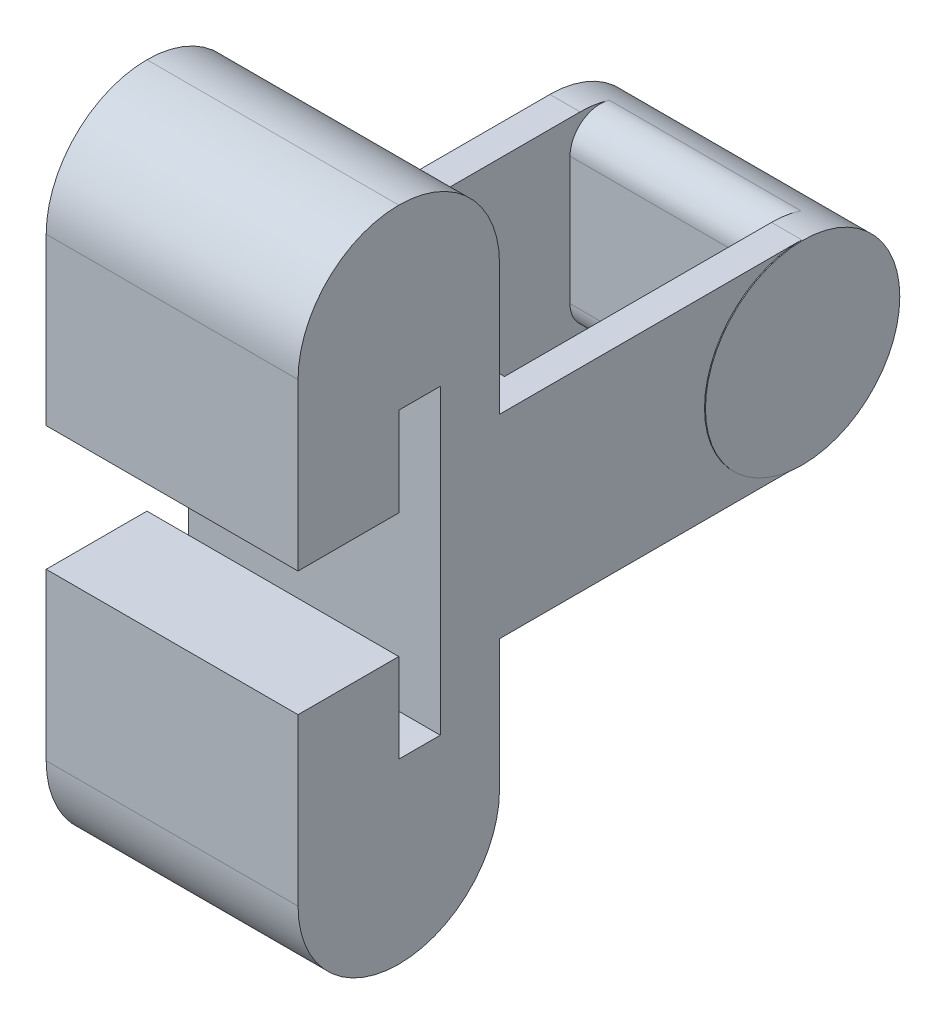
ISO-10303-21;
HEADER;
FILE_DESCRIPTION(('STEP AP214'),'2;1');
FILE_NAME('part.step','',(''),(''),'','','');
FILE_SCHEMA(('AUTOMOTIVE_DESIGN { 1 0 10303 214 1 1 1 1 }'));
ENDSEC;
DATA;
#1=APPLICATION_CONTEXT('core data for automotive mechanical design processes');
#2=APPLICATION_PROTOCOL_DEFINITION('international standard','automotive_design',2000,#1);
#3=PRODUCT_CONTEXT('',#1,'mechanical');
#4=PRODUCT('Part','Part','',(#3));
#5=PRODUCT_RELATED_PRODUCT_CATEGORY('part','',(#4));
#6=PRODUCT_DEFINITION_FORMATION('','',#4);
#7=PRODUCT_DEFINITION_CONTEXT('part definition',#1,'design');
#8=PRODUCT_DEFINITION('design','',#6,#7);
#9=PRODUCT_DEFINITION_SHAPE('','',#8);
#10=(LENGTH_UNIT() NAMED_UNIT(*) SI_UNIT(.MILLI.,.METRE.));
#11=(NAMED_UNIT(*) PLANE_ANGLE_UNIT() SI_UNIT($,.RADIAN.));
#12=(NAMED_UNIT(*) SI_UNIT($,.STERADIAN.) SOLID_ANGLE_UNIT());
#13=UNCERTAINTY_MEASURE_WITH_UNIT(LENGTH_MEASURE(1.E-05),#10,'distance_accuracy_value','');
#14=(GEOMETRIC_REPRESENTATION_CONTEXT(3) GLOBAL_UNCERTAINTY_ASSIGNED_CONTEXT((#13)) GLOBAL_UNIT_ASSIGNED_CONTEXT((#10,
#11,#12)) REPRESENTATION_CONTEXT('',''));
#15=CARTESIAN_POINT('',(0.,0.,0.));
#16=DIRECTION('',(0.,0.,1.));
#17=DIRECTION('',(1.,0.,0.));
#18=AXIS2_PLACEMENT_3D('',#15,#16,#17);
#19=CARTESIAN_POINT('',(0.,38.1,0.));
#20=DIRECTION('',(0.,1.,0.));
#21=DIRECTION('',(-1.,0.,0.));
#22=AXIS2_PLACEMENT_3D('',#19,#20,#21);
#23=PLANE('',#22);
#24=DIRECTION('',(1.,0.,0.));
#25=VECTOR('',#24,1.);
#26=CARTESIAN_POINT('',(0.,38.1,101.6));
#27=LINE('',#26,#25);
#28=CARTESIAN_POINT('',(-63.5,38.1,101.6));
#29=VERTEX_POINT('',#28);
#30=CARTESIAN_POINT('',(0.,38.1,101.6));
#31=VERTEX_POINT('',#30);
#32=EDGE_CURVE('E282',#29,#31,#27,.T.);
#33=ORIENTED_EDGE('',*,*,#32,.F.);
#34=DIRECTION('',(0.,0.,1.));
#35=VECTOR('',#34,1.);
#36=CARTESIAN_POINT('',(-63.5,38.1,76.2));
#37=LINE('',#36,#35);
#38=CARTESIAN_POINT('',(-63.5,38.1,91.1297825490581));
#39=VERTEX_POINT('',#38);
#40=EDGE_CURVE('E303',#39,#29,#37,.T.);
#41=ORIENTED_EDGE('',*,*,#40,.F.);
#42=DIRECTION('',(-1.,0.,0.));
#43=VECTOR('',#42,1.);
#44=CARTESIAN_POINT('',(0.,38.1,91.1297825490581));
#45=LINE('',#44,#43);
#46=CARTESIAN_POINT('',(0.,38.1,91.1297825490581));
#47=VERTEX_POINT('',#46);
#48=EDGE_CURVE('E311',#47,#39,#45,.T.);
#49=ORIENTED_EDGE('',*,*,#48,.F.);
#50=DIRECTION('',(0.,0.,-1.));
#51=VECTOR('',#50,1.);
#52=CARTESIAN_POINT('',(0.,38.1,127.));
#53=LINE('',#52,#51);
#54=EDGE_CURVE('E301',#31,#47,#53,.T.);
#55=ORIENTED_EDGE('',*,*,#54,.F.);
#56=EDGE_LOOP('',(#33,#41,#49,#55));
#57=FACE_BOUND('',#56,.T.);
#58=ADVANCED_FACE('F47',(#57),#23,.F.);
#59=CARTESIAN_POINT('',(0.2286,0.,0.));
#60=DIRECTION('',(-1.,0.,0.));
#61=DIRECTION('',(0.,0.,1.));
#62=AXIS2_PLACEMENT_3D('',#59,#60,#61);
#63=CYLINDRICAL_SURFACE('',#62,24.5059058177304);
#64=CARTESIAN_POINT('',(0.2286,0.,0.));
#65=DIRECTION('',(1.,0.,0.));
#66=DIRECTION('',(0.,0.,-1.));
#67=AXIS2_PLACEMENT_3D('',#64,#65,#66);
#68=CIRCLE('',#67,24.5059058177304);
#69=CARTESIAN_POINT('',(0.2286,0.,-24.5059058177304));
#70=VERTEX_POINT('',#69);
#71=EDGE_CURVE('E354',#70,#70,#68,.T.);
#72=ORIENTED_EDGE('',*,*,#71,.F.);
#73=EDGE_LOOP('',(#72));
#74=FACE_BOUND('',#73,.T.);
#75=DIRECTION('',(-1.,0.,0.));
#76=VECTOR('',#75,1.);
#77=CARTESIAN_POINT('',(0.2286,-23.3706404062894,-7.37242069793817));
#78=LINE('',#77,#76);
#79=CARTESIAN_POINT('',(-7.62000000000001,-23.3706404062894,-7.37242069793817));
#80=VERTEX_POINT('',#79);
#81=CARTESIAN_POINT('',(-55.88,-23.3706404062894,-7.37242069793817));
#82=VERTEX_POINT('',#81);
#83=EDGE_CURVE('E399',#80,#82,#78,.T.);
#84=ORIENTED_EDGE('',*,*,#83,.T.);
#85=CARTESIAN_POINT('',(-55.88,0.,0.));
#86=DIRECTION('',(-1.,0.,0.));
#87=DIRECTION('',(0.,0.,1.));
#88=AXIS2_PLACEMENT_3D('',#85,#86,#87);
#89=CIRCLE('',#88,24.5059058177304);
#90=CARTESIAN_POINT('',(-55.88,-24.5059058177304,0.));
#91=VERTEX_POINT('',#90);
#92=EDGE_CURVE('E402',#82,#91,#89,.T.);
#93=ORIENTED_EDGE('',*,*,#92,.T.);
#94=DIRECTION('',(1.,0.,0.));
#95=VECTOR('',#94,1.);
#96=CARTESIAN_POINT('',(-63.5,-24.5059058177304,0.));
#97=LINE('',#96,#95);
#98=CARTESIAN_POINT('',(-63.5,-24.5059058177304,0.));
#99=VERTEX_POINT('',#98);
#100=EDGE_CURVE('E350',#99,#91,#97,.T.);
#101=ORIENTED_EDGE('',*,*,#100,.F.);
#102=CARTESIAN_POINT('',(-63.5,0.,0.));
#103=DIRECTION('',(-1.,0.,0.));
#104=DIRECTION('',(0.,0.,1.));
#105=AXIS2_PLACEMENT_3D('',#102,#103,#104);
#106=CIRCLE('',#105,24.5059058177304);
#107=CARTESIAN_POINT('',(-63.5,24.5059058177304,0.));
#108=VERTEX_POINT('',#107);
#109=EDGE_CURVE('E329',#108,#99,#106,.T.);
#110=ORIENTED_EDGE('',*,*,#109,.F.);
#111=DIRECTION('',(1.,0.,0.));
#112=VECTOR('',#111,1.);
#113=CARTESIAN_POINT('',(-63.5,24.5059058177304,0.));
#114=LINE('',#113,#112);
#115=CARTESIAN_POINT('',(-55.88,24.5059058177304,0.));
#116=VERTEX_POINT('',#115);
#117=EDGE_CURVE('E342',#108,#116,#114,.T.);
#118=ORIENTED_EDGE('',*,*,#117,.T.);
#119=CARTESIAN_POINT('',(-55.88,0.,0.));
#120=DIRECTION('',(-1.,0.,0.));
#121=DIRECTION('',(0.,0.,1.));
#122=AXIS2_PLACEMENT_3D('',#119,#120,#121);
#123=CIRCLE('',#122,24.5059058177304);
#124=CARTESIAN_POINT('',(-55.88,23.3706404062894,-7.37242069793818));
#125=VERTEX_POINT('',#124);
#126=EDGE_CURVE('E234',#116,#125,#123,.T.);
#127=ORIENTED_EDGE('',*,*,#126,.T.);
#128=DIRECTION('',(-1.,0.,0.));
#129=VECTOR('',#128,1.);
#130=CARTESIAN_POINT('',(0.2286,23.3706404062894,-7.37242069793818));
#131=LINE('',#130,#129);
#132=CARTESIAN_POINT('',(-7.62000000000001,23.3706404062894,-7.37242069793818));
#133=VERTEX_POINT('',#132);
#134=EDGE_CURVE('E392',#125,#133,#131,.F.);
#135=ORIENTED_EDGE('',*,*,#134,.T.);
#136=CARTESIAN_POINT('',(-7.62000000000001,0.,0.));
#137=DIRECTION('',(1.,0.,0.));
#138=DIRECTION('',(0.,0.,-1.));
#139=AXIS2_PLACEMENT_3D('',#136,#137,#138);
#140=CIRCLE('',#139,24.5059058177304);
#141=CARTESIAN_POINT('',(-7.62000000000001,24.5059058177304,0.));
#142=VERTEX_POINT('',#141);
#143=EDGE_CURVE('E387',#133,#142,#140,.T.);
#144=ORIENTED_EDGE('',*,*,#143,.T.);
#145=CARTESIAN_POINT('',(0.,24.5059058177304,0.));
#146=VERTEX_POINT('',#145);
#147=EDGE_CURVE('E337',#142,#146,#114,.T.);
#148=ORIENTED_EDGE('',*,*,#147,.T.);
#149=CARTESIAN_POINT('',(0.,0.,0.));
#150=DIRECTION('',(1.,0.,0.));
#151=DIRECTION('',(0.,0.,-1.));
#152=AXIS2_PLACEMENT_3D('',#149,#150,#151);
#153=CIRCLE('',#152,24.5059058177304);
#154=CARTESIAN_POINT('',(0.,-24.5059058177304,0.));
#155=VERTEX_POINT('',#154);
#156=EDGE_CURVE('E353',#146,#155,#153,.T.);
#157=ORIENTED_EDGE('',*,*,#156,.T.);
#158=CARTESIAN_POINT('',(-7.62000000000001,-24.5059058177304,0.));
#159=VERTEX_POINT('',#158);
#160=EDGE_CURVE('E349',#159,#155,#97,.T.);
#161=ORIENTED_EDGE('',*,*,#160,.F.);
#162=CARTESIAN_POINT('',(-7.62000000000001,0.,0.));
#163=DIRECTION('',(1.,0.,0.));
#164=DIRECTION('',(0.,0.,-1.));
#165=AXIS2_PLACEMENT_3D('',#162,#163,#164);
#166=CIRCLE('',#165,24.5059058177304);
#167=EDGE_CURVE('E396',#159,#80,#166,.T.);
#168=ORIENTED_EDGE('',*,*,#167,.T.);
#169=EDGE_LOOP('',(#84,#93,#101,#110,#118,#127,#135,#144,#148,#157,#161,#168));
#170=FACE_BOUND('',#169,.T.);
#171=ADVANCED_FACE('F418',(#74,#170),#63,.T.);
#172=CARTESIAN_POINT('',(0.2286,0.,0.));
#173=DIRECTION('',(1.,0.,0.));
#174=DIRECTION('',(0.,0.,-1.));
#175=AXIS2_PLACEMENT_3D('',#172,#173,#174);
#176=PLANE('',#175);
#177=ORIENTED_EDGE('',*,*,#71,.T.);
#178=EDGE_LOOP('',(#177));
#179=FACE_BOUND('',#178,.T.);
#180=ADVANCED_FACE('F527',(#179),#176,.T.);
#181=CARTESIAN_POINT('',(-63.5,-24.5059058177305,76.2));
#182=DIRECTION('',(0.,1.,0.));
#183=DIRECTION('',(0.,0.,1.));
#184=AXIS2_PLACEMENT_3D('',#181,#182,#183);
#185=PLANE('',#184);
#186=ORIENTED_EDGE('',*,*,#100,.T.);
#187=DIRECTION('',(0.,0.,1.));
#188=VECTOR('',#187,1.);
#189=CARTESIAN_POINT('',(-55.88,-24.5059058177305,76.2));
#190=LINE('',#189,#188);
#191=CARTESIAN_POINT('',(-55.88,-24.5059058177305,67.31));
#192=VERTEX_POINT('',#191);
#193=EDGE_CURVE('E246',#91,#192,#190,.T.);
#194=ORIENTED_EDGE('',*,*,#193,.T.);
#195=DIRECTION('',(1.,0.,0.));
#196=VECTOR('',#195,1.);
#197=CARTESIAN_POINT('',(-63.5,-24.5059058177305,67.31));
#198=LINE('',#197,#196);
#199=CARTESIAN_POINT('',(-7.62,-24.5059058177305,67.31));
#200=VERTEX_POINT('',#199);
#201=EDGE_CURVE('E226',#192,#200,#198,.T.);
#202=ORIENTED_EDGE('',*,*,#201,.T.);
#203=DIRECTION('',(0.,0.,-1.));
#204=VECTOR('',#203,1.);
#205=CARTESIAN_POINT('',(-7.62,-24.5059058177305,76.2));
#206=LINE('',#205,#204);
#207=EDGE_CURVE('E70',#200,#159,#206,.T.);
#208=ORIENTED_EDGE('',*,*,#207,.T.);
#209=ORIENTED_EDGE('',*,*,#160,.T.);
#210=DIRECTION('',(0.,0.,1.));
#211=VECTOR('',#210,1.);
#212=CARTESIAN_POINT('',(0.,-24.5059058177305,76.2));
#213=LINE('',#212,#211);
#214=CARTESIAN_POINT('',(0.,-24.5059058177305,76.2));
#215=VERTEX_POINT('',#214);
#216=EDGE_CURVE('E324',#155,#215,#213,.T.);
#217=ORIENTED_EDGE('',*,*,#216,.T.);
#218=DIRECTION('',(1.,0.,0.));
#219=VECTOR('',#218,1.);
#220=CARTESIAN_POINT('',(-63.5,-24.5059058177305,76.2));
#221=LINE('',#220,#219);
#222=CARTESIAN_POINT('',(-63.5,-24.5059058177305,76.2));
#223=VERTEX_POINT('',#222);
#224=EDGE_CURVE('E346',#223,#215,#221,.T.);
#225=ORIENTED_EDGE('',*,*,#224,.F.);
#226=DIRECTION('',(0.,0.,1.));
#227=VECTOR('',#226,1.);
#228=CARTESIAN_POINT('',(-63.5,-24.5059058177305,76.2));
#229=LINE('',#228,#227);
#230=EDGE_CURVE('E332',#99,#223,#229,.T.);
#231=ORIENTED_EDGE('',*,*,#230,.F.);
#232=EDGE_LOOP('',(#186,#194,#202,#208,#209,#217,#225,#231));
#233=FACE_BOUND('',#232,.T.);
#234=ADVANCED_FACE('F435',(#233),#185,.F.);
#235=CARTESIAN_POINT('',(-63.5,24.5059058177304,0.));
#236=DIRECTION('',(0.,-1.,0.));
#237=DIRECTION('',(0.,0.,-1.));
#238=AXIS2_PLACEMENT_3D('',#235,#236,#237);
#239=PLANE('',#238);
#240=DIRECTION('',(0.,0.,1.));
#241=VECTOR('',#240,1.);
#242=CARTESIAN_POINT('',(-55.88,24.5059058177304,2.53999999999999));
#243=LINE('',#242,#241);
#244=CARTESIAN_POINT('',(-55.88,24.5059058177305,67.31));
#245=VERTEX_POINT('',#244);
#246=EDGE_CURVE('E62',#116,#245,#243,.T.);
#247=ORIENTED_EDGE('',*,*,#246,.F.);
#248=ORIENTED_EDGE('',*,*,#117,.F.);
#249=DIRECTION('',(0.,0.,-1.));
#250=VECTOR('',#249,1.);
#251=CARTESIAN_POINT('',(-63.5,24.5059058177304,0.));
#252=LINE('',#251,#250);
#253=CARTESIAN_POINT('',(-63.5,24.5059058177305,76.2));
#254=VERTEX_POINT('',#253);
#255=EDGE_CURVE('E335',#254,#108,#252,.T.);
#256=ORIENTED_EDGE('',*,*,#255,.F.);
#257=DIRECTION('',(1.,0.,0.));
#258=VECTOR('',#257,1.);
#259=CARTESIAN_POINT('',(-63.5,24.5059058177305,76.2));
#260=LINE('',#259,#258);
#261=CARTESIAN_POINT('',(0.,24.5059058177305,76.2));
#262=VERTEX_POINT('',#261);
#263=EDGE_CURVE('E344',#254,#262,#260,.T.);
#264=ORIENTED_EDGE('',*,*,#263,.T.);
#265=DIRECTION('',(0.,0.,-1.));
#266=VECTOR('',#265,1.);
#267=CARTESIAN_POINT('',(0.,24.5059058177304,0.));
#268=LINE('',#267,#266);
#269=EDGE_CURVE('E333',#262,#146,#268,.T.);
#270=ORIENTED_EDGE('',*,*,#269,.T.);
#271=ORIENTED_EDGE('',*,*,#147,.F.);
#272=DIRECTION('',(0.,0.,-1.));
#273=VECTOR('',#272,1.);
#274=CARTESIAN_POINT('',(-7.62,24.5059058177305,67.31));
#275=LINE('',#274,#273);
#276=CARTESIAN_POINT('',(-7.62,24.5059058177305,67.31));
#277=VERTEX_POINT('',#276);
#278=EDGE_CURVE('E236',#277,#142,#275,.T.);
#279=ORIENTED_EDGE('',*,*,#278,.F.);
#280=DIRECTION('',(1.,0.,0.));
#281=VECTOR('',#280,1.);
#282=CARTESIAN_POINT('',(-55.88,24.5059058177305,67.31));
#283=LINE('',#282,#281);
#284=EDGE_CURVE('E224',#245,#277,#283,.T.);
#285=ORIENTED_EDGE('',*,*,#284,.F.);
#286=EDGE_LOOP('',(#247,#248,#256,#264,#270,#271,#279,#285));
#287=FACE_BOUND('',#286,.T.);
#288=ADVANCED_FACE('F238',(#287),#239,.F.);
#289=CARTESIAN_POINT('',(-63.5,0.,0.));
#290=DIRECTION('',(-1.,0.,0.));
#291=DIRECTION('',(0.,0.,1.));
#292=AXIS2_PLACEMENT_3D('',#289,#290,#291);
#293=PLANE('',#292);
#294=DIRECTION('',(0.,-1.,0.));
#295=VECTOR('',#294,1.);
#296=CARTESIAN_POINT('',(-63.5,38.1,76.2));
#297=LINE('',#296,#295);
#298=CARTESIAN_POINT('',(-63.5,-57.4893476471741,76.2));
#299=VERTEX_POINT('',#298);
#300=EDGE_CURVE('E310',#223,#299,#297,.T.);
#301=ORIENTED_EDGE('',*,*,#300,.T.);
#302=CARTESIAN_POINT('',(-63.5,-57.4893476471742,101.6));
#303=DIRECTION('',(-1.,0.,0.));
#304=DIRECTION('',(0.,0.,1.));
#305=AXIS2_PLACEMENT_3D('',#302,#303,#304);
#306=CIRCLE('',#305,25.4);
#307=CARTESIAN_POINT('',(-63.5,-82.8893476471741,101.6));
#308=VERTEX_POINT('',#307);
#309=EDGE_CURVE('E379',#299,#308,#306,.T.);
#310=ORIENTED_EDGE('',*,*,#309,.T.);
#311=CARTESIAN_POINT('',(-63.5,-57.4893476471742,101.6));
#312=DIRECTION('',(-1.,0.,0.));
#313=DIRECTION('',(0.,0.,1.));
#314=AXIS2_PLACEMENT_3D('',#311,#312,#313);
#315=CIRCLE('',#314,25.4);
#316=CARTESIAN_POINT('',(-63.5,-57.4893476471742,127.));
#317=VERTEX_POINT('',#316);
#318=EDGE_CURVE('E377',#308,#317,#315,.T.);
#319=ORIENTED_EDGE('',*,*,#318,.T.);
#320=DIRECTION('',(0.,1.,0.));
#321=VECTOR('',#320,1.);
#322=CARTESIAN_POINT('',(-63.5,-82.8893476471741,127.));
#323=LINE('',#322,#321);
#324=CARTESIAN_POINT('',(-63.5,-15.68196,127.));
#325=VERTEX_POINT('',#324);
#326=EDGE_CURVE('E278',#317,#325,#323,.T.);
#327=ORIENTED_EDGE('',*,*,#326,.T.);
#328=DIRECTION('',(0.,0.,-1.));
#329=VECTOR('',#328,1.);
#330=CARTESIAN_POINT('',(-63.5,-15.68196,101.6));
#331=LINE('',#330,#329);
#332=CARTESIAN_POINT('',(-63.5,-15.68196,101.6));
#333=VERTEX_POINT('',#332);
#334=EDGE_CURVE('E254',#325,#333,#331,.T.);
#335=ORIENTED_EDGE('',*,*,#334,.T.);
#336=DIRECTION('',(0.,-1.,0.));
#337=VECTOR('',#336,1.);
#338=CARTESIAN_POINT('',(-63.5,-15.68196,101.6));
#339=LINE('',#338,#337);
#340=CARTESIAN_POINT('',(-63.5,-38.1,101.6));
#341=VERTEX_POINT('',#340);
#342=EDGE_CURVE('E266',#333,#341,#339,.T.);
#343=ORIENTED_EDGE('',*,*,#342,.T.);
#344=DIRECTION('',(0.,0.,1.));
#345=VECTOR('',#344,1.);
#346=CARTESIAN_POINT('',(-63.5,-38.1,76.2));
#347=LINE('',#346,#345);
#348=CARTESIAN_POINT('',(-63.5,-38.1,91.1297825490581));
#349=VERTEX_POINT('',#348);
#350=EDGE_CURVE('E275',#349,#341,#347,.T.);
#351=ORIENTED_EDGE('',*,*,#350,.F.);
#352=DIRECTION('',(0.,-1.,0.));
#353=VECTOR('',#352,1.);
#354=CARTESIAN_POINT('',(-63.5,38.1,91.1297825490581));
#355=LINE('',#354,#353);
#356=EDGE_CURVE('E314',#39,#349,#355,.T.);
#357=ORIENTED_EDGE('',*,*,#356,.F.);
#358=ORIENTED_EDGE('',*,*,#40,.T.);
#359=DIRECTION('',(0.,1.,0.));
#360=VECTOR('',#359,1.);
#361=CARTESIAN_POINT('',(-63.5,15.68196,101.6));
#362=LINE('',#361,#360);
#363=CARTESIAN_POINT('',(-63.5,15.68196,101.6));
#364=VERTEX_POINT('',#363);
#365=EDGE_CURVE('E298',#364,#29,#362,.T.);
#366=ORIENTED_EDGE('',*,*,#365,.F.);
#367=DIRECTION('',(0.,0.,-1.));
#368=VECTOR('',#367,1.);
#369=CARTESIAN_POINT('',(-63.5,15.68196,101.6));
#370=LINE('',#369,#368);
#371=CARTESIAN_POINT('',(-63.5,15.68196,127.));
#372=VERTEX_POINT('',#371);
#373=EDGE_CURVE('E283',#372,#364,#370,.T.);
#374=ORIENTED_EDGE('',*,*,#373,.F.);
#375=DIRECTION('',(0.,-1.,0.));
#376=VECTOR('',#375,1.);
#377=CARTESIAN_POINT('',(-63.5,82.8893476471741,127.));
#378=LINE('',#377,#376);
#379=CARTESIAN_POINT('',(-63.5,57.4893476471742,127.));
#380=VERTEX_POINT('',#379);
#381=EDGE_CURVE('E308',#380,#372,#378,.T.);
#382=ORIENTED_EDGE('',*,*,#381,.F.);
#383=CARTESIAN_POINT('',(-63.5,57.4893476471742,101.6));
#384=DIRECTION('',(-1.,0.,0.));
#385=DIRECTION('',(0.,0.,1.));
#386=AXIS2_PLACEMENT_3D('',#383,#384,#385);
#387=CIRCLE('',#386,25.4);
#388=CARTESIAN_POINT('',(-63.5,82.8893476471741,101.6));
#389=VERTEX_POINT('',#388);
#390=EDGE_CURVE('E357',#380,#389,#387,.T.);
#391=ORIENTED_EDGE('',*,*,#390,.T.);
#392=CARTESIAN_POINT('',(-63.5,57.4893476471742,101.6));
#393=DIRECTION('',(-1.,0.,0.));
#394=DIRECTION('',(0.,0.,1.));
#395=AXIS2_PLACEMENT_3D('',#392,#393,#394);
#396=CIRCLE('',#395,25.4);
#397=CARTESIAN_POINT('',(-63.5,57.4893476471742,76.2));
#398=VERTEX_POINT('',#397);
#399=EDGE_CURVE('E361',#389,#398,#396,.T.);
#400=ORIENTED_EDGE('',*,*,#399,.T.);
#401=EDGE_CURVE('E325',#398,#254,#297,.T.);
#402=ORIENTED_EDGE('',*,*,#401,.T.);
#403=ORIENTED_EDGE('',*,*,#255,.T.);
#404=ORIENTED_EDGE('',*,*,#109,.T.);
#405=ORIENTED_EDGE('',*,*,#230,.T.);
#406=EDGE_LOOP('',(#301,#310,#319,#327,#335,#343,#351,#357,#358,#366,#374,#382,#391,#400,#402,
#403,#404,#405));
#407=FACE_BOUND('',#406,.T.);
#408=ADVANCED_FACE('F452',(#407),#293,.T.);
#409=CARTESIAN_POINT('',(0.,0.,0.));
#410=DIRECTION('',(-1.,0.,0.));
#411=DIRECTION('',(0.,0.,1.));
#412=AXIS2_PLACEMENT_3D('',#409,#410,#411);
#413=PLANE('',#412);
#414=CARTESIAN_POINT('',(0.,-57.4893476471742,101.6));
#415=DIRECTION('',(-1.,0.,0.));
#416=DIRECTION('',(0.,0.,1.));
#417=AXIS2_PLACEMENT_3D('',#414,#415,#416);
#418=CIRCLE('',#417,25.4);
#419=CARTESIAN_POINT('',(0.,-57.4893476471742,127.));
#420=VERTEX_POINT('',#419);
#421=CARTESIAN_POINT('',(0.,-82.8893476471742,101.6));
#422=VERTEX_POINT('',#421);
#423=EDGE_CURVE('E381',#420,#422,#418,.F.);
#424=ORIENTED_EDGE('',*,*,#423,.T.);
#425=CARTESIAN_POINT('',(0.,-57.4893476471742,101.6));
#426=DIRECTION('',(-1.,0.,0.));
#427=DIRECTION('',(0.,0.,1.));
#428=AXIS2_PLACEMENT_3D('',#425,#426,#427);
#429=CIRCLE('',#428,25.4);
#430=CARTESIAN_POINT('',(0.,-57.4893476471742,76.2));
#431=VERTEX_POINT('',#430);
#432=EDGE_CURVE('E383',#422,#431,#429,.F.);
#433=ORIENTED_EDGE('',*,*,#432,.T.);
#434=DIRECTION('',(0.,1.,0.));
#435=VECTOR('',#434,1.);
#436=CARTESIAN_POINT('',(0.,-38.1,76.2));
#437=LINE('',#436,#435);
#438=EDGE_CURVE('E315',#431,#215,#437,.T.);
#439=ORIENTED_EDGE('',*,*,#438,.T.);
#440=ORIENTED_EDGE('',*,*,#216,.F.);
#441=ORIENTED_EDGE('',*,*,#156,.F.);
#442=ORIENTED_EDGE('',*,*,#269,.F.);
#443=CARTESIAN_POINT('',(0.,57.4893476471742,76.2));
#444=VERTEX_POINT('',#443);
#445=EDGE_CURVE('E327',#262,#444,#437,.T.);
#446=ORIENTED_EDGE('',*,*,#445,.T.);
#447=CARTESIAN_POINT('',(0.,57.4893476471742,101.6));
#448=DIRECTION('',(-1.,0.,0.));
#449=DIRECTION('',(0.,0.,1.));
#450=AXIS2_PLACEMENT_3D('',#447,#448,#449);
#451=CIRCLE('',#450,25.4);
#452=CARTESIAN_POINT('',(0.,82.8893476471742,101.6));
#453=VERTEX_POINT('',#452);
#454=EDGE_CURVE('E368',#444,#453,#451,.F.);
#455=ORIENTED_EDGE('',*,*,#454,.T.);
#456=CARTESIAN_POINT('',(0.,57.4893476471742,101.6));
#457=DIRECTION('',(-1.,0.,0.));
#458=DIRECTION('',(0.,0.,1.));
#459=AXIS2_PLACEMENT_3D('',#456,#457,#458);
#460=CIRCLE('',#459,25.4);
#461=CARTESIAN_POINT('',(0.,57.4893476471742,127.));
#462=VERTEX_POINT('',#461);
#463=EDGE_CURVE('E366',#453,#462,#460,.F.);
#464=ORIENTED_EDGE('',*,*,#463,.T.);
#465=DIRECTION('',(0.,-1.,0.));
#466=VECTOR('',#465,1.);
#467=CARTESIAN_POINT('',(0.,82.8893476471742,127.));
#468=LINE('',#467,#466);
#469=CARTESIAN_POINT('',(0.,15.68196,127.));
#470=VERTEX_POINT('',#469);
#471=EDGE_CURVE('E306',#462,#470,#468,.T.);
#472=ORIENTED_EDGE('',*,*,#471,.T.);
#473=DIRECTION('',(0.,0.,1.));
#474=VECTOR('',#473,1.);
#475=CARTESIAN_POINT('',(0.,15.68196,127.));
#476=LINE('',#475,#474);
#477=CARTESIAN_POINT('',(0.,15.68196,101.6));
#478=VERTEX_POINT('',#477);
#479=EDGE_CURVE('E288',#478,#470,#476,.T.);
#480=ORIENTED_EDGE('',*,*,#479,.F.);
#481=DIRECTION('',(0.,1.,0.));
#482=VECTOR('',#481,1.);
#483=CARTESIAN_POINT('',(0.,15.68196,101.6));
#484=LINE('',#483,#482);
#485=EDGE_CURVE('E294',#478,#31,#484,.T.);
#486=ORIENTED_EDGE('',*,*,#485,.T.);
#487=ORIENTED_EDGE('',*,*,#54,.T.);
#488=DIRECTION('',(0.,1.,0.));
#489=VECTOR('',#488,1.);
#490=CARTESIAN_POINT('',(0.,-38.1,91.1297825490581));
#491=LINE('',#490,#489);
#492=CARTESIAN_POINT('',(0.,-38.1,91.1297825490581));
#493=VERTEX_POINT('',#492);
#494=EDGE_CURVE('E321',#493,#47,#491,.T.);
#495=ORIENTED_EDGE('',*,*,#494,.F.);
#496=DIRECTION('',(0.,0.,-1.));
#497=VECTOR('',#496,1.);
#498=CARTESIAN_POINT('',(0.,-38.1,127.));
#499=LINE('',#498,#497);
#500=CARTESIAN_POINT('',(0.,-38.1,101.6));
#501=VERTEX_POINT('',#500);
#502=EDGE_CURVE('E273',#501,#493,#499,.T.);
#503=ORIENTED_EDGE('',*,*,#502,.F.);
#504=DIRECTION('',(0.,-1.,0.));
#505=VECTOR('',#504,1.);
#506=CARTESIAN_POINT('',(0.,-15.68196,101.6));
#507=LINE('',#506,#505);
#508=CARTESIAN_POINT('',(0.,-15.68196,101.6));
#509=VERTEX_POINT('',#508);
#510=EDGE_CURVE('E270',#509,#501,#507,.T.);
#511=ORIENTED_EDGE('',*,*,#510,.F.);
#512=DIRECTION('',(0.,0.,1.));
#513=VECTOR('',#512,1.);
#514=CARTESIAN_POINT('',(0.,-15.68196,127.));
#515=LINE('',#514,#513);
#516=CARTESIAN_POINT('',(0.,-15.68196,127.));
#517=VERTEX_POINT('',#516);
#518=EDGE_CURVE('E260',#509,#517,#515,.T.);
#519=ORIENTED_EDGE('',*,*,#518,.T.);
#520=DIRECTION('',(0.,1.,0.));
#521=VECTOR('',#520,1.);
#522=CARTESIAN_POINT('',(0.,-82.8893476471742,127.));
#523=LINE('',#522,#521);
#524=EDGE_CURVE('E280',#420,#517,#523,.T.);
#525=ORIENTED_EDGE('',*,*,#524,.F.);
#526=EDGE_LOOP('',(#424,#433,#439,#440,#441,#442,#446,#455,#464,#472,#480,#486,#487,#495,#503,
#511,#519,#525));
#527=FACE_BOUND('',#526,.T.);
#528=ADVANCED_FACE('F438',(#527),#413,.F.);
#529=CARTESIAN_POINT('',(0.,0.,76.2));
#530=DIRECTION('',(0.,0.,1.));
#531=DIRECTION('',(1.,0.,0.));
#532=AXIS2_PLACEMENT_3D('',#529,#530,#531);
#533=PLANE('',#532);
#534=ORIENTED_EDGE('',*,*,#438,.F.);
#535=DIRECTION('',(-1.,0.,0.));
#536=VECTOR('',#535,1.);
#537=CARTESIAN_POINT('',(-63.5,-57.4893476471742,76.2));
#538=LINE('',#537,#536);
#539=EDGE_CURVE('E372',#431,#299,#538,.T.);
#540=ORIENTED_EDGE('',*,*,#539,.T.);
#541=ORIENTED_EDGE('',*,*,#300,.F.);
#542=ORIENTED_EDGE('',*,*,#224,.T.);
#543=EDGE_LOOP('',(#534,#540,#541,#542));
#544=FACE_BOUND('',#543,.T.);
#545=ADVANCED_FACE('F444',(#544),#533,.F.);
#546=CARTESIAN_POINT('',(0.,0.,91.1297825490581));
#547=DIRECTION('',(0.,0.,1.));
#548=DIRECTION('',(1.,0.,0.));
#549=AXIS2_PLACEMENT_3D('',#546,#547,#548);
#550=PLANE('',#549);
#551=ORIENTED_EDGE('',*,*,#48,.T.);
#552=ORIENTED_EDGE('',*,*,#356,.T.);
#553=DIRECTION('',(1.,0.,0.));
#554=VECTOR('',#553,1.);
#555=CARTESIAN_POINT('',(-63.5,-38.1,91.1297825490581));
#556=LINE('',#555,#554);
#557=EDGE_CURVE('E318',#349,#493,#556,.T.);
#558=ORIENTED_EDGE('',*,*,#557,.T.);
#559=ORIENTED_EDGE('',*,*,#494,.T.);
#560=EDGE_LOOP('',(#551,#552,#558,#559));
#561=FACE_BOUND('',#560,.T.);
#562=ADVANCED_FACE('F475',(#561),#550,.T.);
#563=ORIENTED_EDGE('',*,*,#401,.F.);
#564=DIRECTION('',(-1.,0.,0.));
#565=VECTOR('',#564,1.);
#566=CARTESIAN_POINT('',(0.,57.4893476471742,76.2));
#567=LINE('',#566,#565);
#568=EDGE_CURVE('E363',#398,#444,#567,.F.);
#569=ORIENTED_EDGE('',*,*,#568,.T.);
#570=ORIENTED_EDGE('',*,*,#445,.F.);
#571=ORIENTED_EDGE('',*,*,#263,.F.);
#572=EDGE_LOOP('',(#563,#569,#570,#571));
#573=FACE_BOUND('',#572,.T.);
#574=ADVANCED_FACE('F508',(#573),#533,.F.);
#575=CARTESIAN_POINT('',(-63.5,82.8893476471741,127.));
#576=DIRECTION('',(0.,0.,-1.));
#577=DIRECTION('',(-1.,0.,0.));
#578=AXIS2_PLACEMENT_3D('',#575,#576,#577);
#579=PLANE('',#578);
#580=ORIENTED_EDGE('',*,*,#471,.F.);
#581=DIRECTION('',(1.,0.,0.));
#582=VECTOR('',#581,1.);
#583=CARTESIAN_POINT('',(-63.5,57.4893476471742,127.));
#584=LINE('',#583,#582);
#585=EDGE_CURVE('E370',#462,#380,#584,.F.);
#586=ORIENTED_EDGE('',*,*,#585,.T.);
#587=ORIENTED_EDGE('',*,*,#381,.T.);
#588=DIRECTION('',(-1.,0.,0.));
#589=VECTOR('',#588,1.);
#590=CARTESIAN_POINT('',(-63.5,15.68196,127.));
#591=LINE('',#590,#589);
#592=EDGE_CURVE('E291',#470,#372,#591,.T.);
#593=ORIENTED_EDGE('',*,*,#592,.F.);
#594=EDGE_LOOP('',(#580,#586,#587,#593));
#595=FACE_BOUND('',#594,.T.);
#596=ADVANCED_FACE('F493',(#595),#579,.F.);
#597=CARTESIAN_POINT('',(0.,57.4893476471742,101.6));
#598=DIRECTION('',(-1.,0.,0.));
#599=DIRECTION('',(0.,-1.,0.));
#600=AXIS2_PLACEMENT_3D('',#597,#598,#599);
#601=CYLINDRICAL_SURFACE('',#600,25.4);
#602=ORIENTED_EDGE('',*,*,#585,.F.);
#603=ORIENTED_EDGE('',*,*,#463,.F.);
#604=DIRECTION('',(1.,0.,0.));
#605=VECTOR('',#604,1.);
#606=CARTESIAN_POINT('',(0.,82.8893476471742,101.6));
#607=LINE('',#606,#605);
#608=EDGE_CURVE('E300',#389,#453,#607,.T.);
#609=ORIENTED_EDGE('',*,*,#608,.F.);
#610=ORIENTED_EDGE('',*,*,#390,.F.);
#611=EDGE_LOOP('',(#602,#603,#609,#610));
#612=FACE_BOUND('',#611,.T.);
#613=ADVANCED_FACE('F498',(#612),#601,.T.);
#614=CARTESIAN_POINT('',(0.,57.4893476471742,101.6));
#615=DIRECTION('',(1.,0.,0.));
#616=DIRECTION('',(0.,1.,0.));
#617=AXIS2_PLACEMENT_3D('',#614,#615,#616);
#618=CYLINDRICAL_SURFACE('',#617,25.4);
#619=ORIENTED_EDGE('',*,*,#454,.F.);
#620=ORIENTED_EDGE('',*,*,#568,.F.);
#621=ORIENTED_EDGE('',*,*,#399,.F.);
#622=ORIENTED_EDGE('',*,*,#608,.T.);
#623=EDGE_LOOP('',(#619,#620,#621,#622));
#624=FACE_BOUND('',#623,.T.);
#625=ADVANCED_FACE('F503',(#624),#618,.T.);
#626=CARTESIAN_POINT('',(0.,15.68196,101.6));
#627=DIRECTION('',(0.,0.,1.));
#628=DIRECTION('',(0.,-1.,0.));
#629=AXIS2_PLACEMENT_3D('',#626,#627,#628);
#630=PLANE('',#629);
#631=ORIENTED_EDGE('',*,*,#32,.T.);
#632=ORIENTED_EDGE('',*,*,#485,.F.);
#633=DIRECTION('',(1.,0.,0.));
#634=VECTOR('',#633,1.);
#635=CARTESIAN_POINT('',(0.,15.68196,101.6));
#636=LINE('',#635,#634);
#637=EDGE_CURVE('E286',#364,#478,#636,.T.);
#638=ORIENTED_EDGE('',*,*,#637,.F.);
#639=ORIENTED_EDGE('',*,*,#365,.T.);
#640=EDGE_LOOP('',(#631,#632,#638,#639));
#641=FACE_BOUND('',#640,.T.);
#642=ADVANCED_FACE('F485',(#641),#630,.F.);
#643=CARTESIAN_POINT('',(0.,15.68196,0.));
#644=DIRECTION('',(0.,1.,0.));
#645=DIRECTION('',(-1.,0.,0.));
#646=AXIS2_PLACEMENT_3D('',#643,#644,#645);
#647=PLANE('',#646);
#648=ORIENTED_EDGE('',*,*,#373,.T.);
#649=ORIENTED_EDGE('',*,*,#637,.T.);
#650=ORIENTED_EDGE('',*,*,#479,.T.);
#651=ORIENTED_EDGE('',*,*,#592,.T.);
#652=EDGE_LOOP('',(#648,#649,#650,#651));
#653=FACE_BOUND('',#652,.T.);
#654=ADVANCED_FACE('F489',(#653),#647,.F.);
#655=CARTESIAN_POINT('',(-63.5,-82.8893476471741,127.));
#656=DIRECTION('',(0.,0.,1.));
#657=DIRECTION('',(1.,0.,0.));
#658=AXIS2_PLACEMENT_3D('',#655,#656,#657);
#659=PLANE('',#658);
#660=ORIENTED_EDGE('',*,*,#326,.F.);
#661=DIRECTION('',(1.,0.,0.));
#662=VECTOR('',#661,1.);
#663=CARTESIAN_POINT('',(-63.5,-57.4893476471742,127.));
#664=LINE('',#663,#662);
#665=EDGE_CURVE('E385',#317,#420,#664,.T.);
#666=ORIENTED_EDGE('',*,*,#665,.T.);
#667=ORIENTED_EDGE('',*,*,#524,.T.);
#668=DIRECTION('',(-1.,0.,0.));
#669=VECTOR('',#668,1.);
#670=CARTESIAN_POINT('',(-63.5,-15.68196,127.));
#671=LINE('',#670,#669);
#672=EDGE_CURVE('E257',#517,#325,#671,.T.);
#673=ORIENTED_EDGE('',*,*,#672,.T.);
#674=EDGE_LOOP('',(#660,#666,#667,#673));
#675=FACE_BOUND('',#674,.T.);
#676=ADVANCED_FACE('F460',(#675),#659,.T.);
#677=CARTESIAN_POINT('',(0.,-38.1,0.));
#678=DIRECTION('',(0.,-1.,0.));
#679=DIRECTION('',(-1.,0.,0.));
#680=AXIS2_PLACEMENT_3D('',#677,#678,#679);
#681=PLANE('',#680);
#682=ORIENTED_EDGE('',*,*,#350,.T.);
#683=DIRECTION('',(1.,0.,0.));
#684=VECTOR('',#683,1.);
#685=CARTESIAN_POINT('',(0.,-38.1,101.6));
#686=LINE('',#685,#684);
#687=EDGE_CURVE('E253',#341,#501,#686,.T.);
#688=ORIENTED_EDGE('',*,*,#687,.T.);
#689=ORIENTED_EDGE('',*,*,#502,.T.);
#690=ORIENTED_EDGE('',*,*,#557,.F.);
#691=EDGE_LOOP('',(#682,#688,#689,#690));
#692=FACE_BOUND('',#691,.T.);
#693=ADVANCED_FACE('F511',(#692),#681,.F.);
#694=CARTESIAN_POINT('',(-63.5,-57.4893476471742,101.6));
#695=DIRECTION('',(1.,0.,0.));
#696=DIRECTION('',(0.,1.,0.));
#697=AXIS2_PLACEMENT_3D('',#694,#695,#696);
#698=CYLINDRICAL_SURFACE('',#697,25.4);
#699=DIRECTION('',(1.,0.,0.));
#700=VECTOR('',#699,1.);
#701=CARTESIAN_POINT('',(0.,-82.8893476471742,101.6));
#702=LINE('',#701,#700);
#703=EDGE_CURVE('E272',#422,#308,#702,.F.);
#704=ORIENTED_EDGE('',*,*,#703,.F.);
#705=ORIENTED_EDGE('',*,*,#423,.F.);
#706=ORIENTED_EDGE('',*,*,#665,.F.);
#707=ORIENTED_EDGE('',*,*,#318,.F.);
#708=EDGE_LOOP('',(#704,#705,#706,#707));
#709=FACE_BOUND('',#708,.T.);
#710=ADVANCED_FACE('F456',(#709),#698,.T.);
#711=CARTESIAN_POINT('',(0.,-57.4893476471742,101.6));
#712=DIRECTION('',(1.,0.,0.));
#713=DIRECTION('',(0.,1.,0.));
#714=AXIS2_PLACEMENT_3D('',#711,#712,#713);
#715=CYLINDRICAL_SURFACE('',#714,25.4);
#716=ORIENTED_EDGE('',*,*,#432,.F.);
#717=ORIENTED_EDGE('',*,*,#703,.T.);
#718=ORIENTED_EDGE('',*,*,#309,.F.);
#719=ORIENTED_EDGE('',*,*,#539,.F.);
#720=EDGE_LOOP('',(#716,#717,#718,#719));
#721=FACE_BOUND('',#720,.T.);
#722=ADVANCED_FACE('F448',(#721),#715,.T.);
#723=CARTESIAN_POINT('',(0.,-15.68196,101.6));
#724=DIRECTION('',(0.,0.,-1.));
#725=DIRECTION('',(0.,1.,0.));
#726=AXIS2_PLACEMENT_3D('',#723,#724,#725);
#727=PLANE('',#726);
#728=ORIENTED_EDGE('',*,*,#687,.F.);
#729=ORIENTED_EDGE('',*,*,#342,.F.);
#730=DIRECTION('',(1.,0.,0.));
#731=VECTOR('',#730,1.);
#732=CARTESIAN_POINT('',(0.,-15.68196,101.6));
#733=LINE('',#732,#731);
#734=EDGE_CURVE('E263',#333,#509,#733,.T.);
#735=ORIENTED_EDGE('',*,*,#734,.T.);
#736=ORIENTED_EDGE('',*,*,#510,.T.);
#737=EDGE_LOOP('',(#728,#729,#735,#736));
#738=FACE_BOUND('',#737,.T.);
#739=ADVANCED_FACE('F470',(#738),#727,.T.);
#740=CARTESIAN_POINT('',(0.,-15.68196,0.));
#741=DIRECTION('',(0.,-1.,0.));
#742=DIRECTION('',(-1.,0.,0.));
#743=AXIS2_PLACEMENT_3D('',#740,#741,#742);
#744=PLANE('',#743);
#745=ORIENTED_EDGE('',*,*,#334,.F.);
#746=ORIENTED_EDGE('',*,*,#672,.F.);
#747=ORIENTED_EDGE('',*,*,#518,.F.);
#748=ORIENTED_EDGE('',*,*,#734,.F.);
#749=EDGE_LOOP('',(#745,#746,#747,#748));
#750=FACE_BOUND('',#749,.T.);
#751=ADVANCED_FACE('F467',(#750),#744,.F.);
#752=CARTESIAN_POINT('',(-7.62,-82.8893476471742,67.31));
#753=DIRECTION('',(1.,0.,0.));
#754=DIRECTION('',(0.,0.,-1.));
#755=AXIS2_PLACEMENT_3D('',#752,#753,#754);
#756=PLANE('',#755);
#757=DIRECTION('',(0.,1.,0.));
#758=VECTOR('',#757,1.);
#759=CARTESIAN_POINT('',(-7.62,-82.8893476471742,67.31));
#760=LINE('',#759,#758);
#761=EDGE_CURVE('E229',#200,#277,#760,.T.);
#762=ORIENTED_EDGE('',*,*,#761,.T.);
#763=ORIENTED_EDGE('',*,*,#278,.T.);
#764=ORIENTED_EDGE('',*,*,#143,.F.);
#765=CARTESIAN_POINT('',(-7.62000000000001,16.1036460245891,-5.08));
#766=DIRECTION('',(1.,0.,0.));
#767=DIRECTION('',(0.,0.,-1.));
#768=AXIS2_PLACEMENT_3D('',#765,#766,#767);
#769=CIRCLE('',#768,7.62);
#770=CARTESIAN_POINT('',(-7.62000000000001,16.103646024589,2.54));
#771=VERTEX_POINT('',#770);
#772=EDGE_CURVE('E11',#133,#771,#769,.T.);
#773=ORIENTED_EDGE('',*,*,#772,.T.);
#774=DIRECTION('',(0.,1.,0.));
#775=VECTOR('',#774,1.);
#776=CARTESIAN_POINT('',(-7.62000000000001,-82.8893476471742,2.54000000000002));
#777=LINE('',#776,#775);
#778=CARTESIAN_POINT('',(-7.62000000000001,-16.1036460245891,2.54));
#779=VERTEX_POINT('',#778);
#780=EDGE_CURVE('E240',#779,#771,#777,.T.);
#781=ORIENTED_EDGE('',*,*,#780,.F.);
#782=CARTESIAN_POINT('',(-7.62000000000001,-16.1036460245891,-5.07999999999999));
#783=DIRECTION('',(1.,0.,0.));
#784=DIRECTION('',(0.,0.,-1.));
#785=AXIS2_PLACEMENT_3D('',#782,#783,#784);
#786=CIRCLE('',#785,7.62);
#787=EDGE_CURVE('E412',#779,#80,#786,.T.);
#788=ORIENTED_EDGE('',*,*,#787,.T.);
#789=ORIENTED_EDGE('',*,*,#167,.F.);
#790=ORIENTED_EDGE('',*,*,#207,.F.);
#791=EDGE_LOOP('',(#762,#763,#764,#773,#781,#788,#789,#790));
#792=FACE_BOUND('',#791,.T.);
#793=ADVANCED_FACE('F423',(#792),#756,.F.);
#794=CARTESIAN_POINT('',(-55.88,-82.8893476471742,67.31));
#795=DIRECTION('',(0.,0.,1.));
#796=DIRECTION('',(0.,-1.,0.));
#797=AXIS2_PLACEMENT_3D('',#794,#795,#796);
#798=PLANE('',#797);
#799=DIRECTION('',(0.,1.,0.));
#800=VECTOR('',#799,1.);
#801=CARTESIAN_POINT('',(-55.88,-82.8893476471742,67.31));
#802=LINE('',#801,#800);
#803=EDGE_CURVE('E221',#192,#245,#802,.T.);
#804=ORIENTED_EDGE('',*,*,#803,.T.);
#805=ORIENTED_EDGE('',*,*,#284,.T.);
#806=ORIENTED_EDGE('',*,*,#761,.F.);
#807=ORIENTED_EDGE('',*,*,#201,.F.);
#808=EDGE_LOOP('',(#804,#805,#806,#807));
#809=FACE_BOUND('',#808,.T.);
#810=ADVANCED_FACE('F222',(#809),#798,.F.);
#811=CARTESIAN_POINT('',(-55.88,-82.8893476471742,2.54000000000002));
#812=DIRECTION('',(-1.,0.,0.));
#813=DIRECTION('',(0.,0.,1.));
#814=AXIS2_PLACEMENT_3D('',#811,#812,#813);
#815=PLANE('',#814);
#816=ORIENTED_EDGE('',*,*,#193,.F.);
#817=ORIENTED_EDGE('',*,*,#92,.F.);
#818=CARTESIAN_POINT('',(-55.88,-16.1036460245891,-5.07999999999999));
#819=DIRECTION('',(-1.,0.,0.));
#820=DIRECTION('',(0.,0.,1.));
#821=AXIS2_PLACEMENT_3D('',#818,#819,#820);
#822=CIRCLE('',#821,7.62);
#823=CARTESIAN_POINT('',(-55.88,-16.1036460245891,2.54));
#824=VERTEX_POINT('',#823);
#825=EDGE_CURVE('E410',#82,#824,#822,.T.);
#826=ORIENTED_EDGE('',*,*,#825,.T.);
#827=DIRECTION('',(0.,1.,0.));
#828=VECTOR('',#827,1.);
#829=CARTESIAN_POINT('',(-55.88,-82.8893476471742,2.54000000000002));
#830=LINE('',#829,#828);
#831=CARTESIAN_POINT('',(-55.88,16.103646024589,2.54));
#832=VERTEX_POINT('',#831);
#833=EDGE_CURVE('E230',#824,#832,#830,.T.);
#834=ORIENTED_EDGE('',*,*,#833,.T.);
#835=CARTESIAN_POINT('',(-55.88,16.1036460245891,-5.08));
#836=DIRECTION('',(-1.,0.,0.));
#837=DIRECTION('',(0.,0.,1.));
#838=AXIS2_PLACEMENT_3D('',#835,#836,#837);
#839=CIRCLE('',#838,7.62);
#840=EDGE_CURVE('E55',#832,#125,#839,.T.);
#841=ORIENTED_EDGE('',*,*,#840,.T.);
#842=ORIENTED_EDGE('',*,*,#126,.F.);
#843=ORIENTED_EDGE('',*,*,#246,.T.);
#844=ORIENTED_EDGE('',*,*,#803,.F.);
#845=EDGE_LOOP('',(#816,#817,#826,#834,#841,#842,#843,#844));
#846=FACE_BOUND('',#845,.T.);
#847=ADVANCED_FACE('F232',(#846),#815,.F.);
#848=CARTESIAN_POINT('',(-7.62000000000001,-82.8893476471742,2.54000000000002));
#849=DIRECTION('',(0.,0.,-1.));
#850=DIRECTION('',(0.,1.,0.));
#851=AXIS2_PLACEMENT_3D('',#848,#849,#850);
#852=PLANE('',#851);
#853=ORIENTED_EDGE('',*,*,#833,.F.);
#854=DIRECTION('',(-1.,0.,0.));
#855=VECTOR('',#854,1.);
#856=CARTESIAN_POINT('',(-7.62000000000001,-16.1036460245891,2.54));
#857=LINE('',#856,#855);
#858=EDGE_CURVE('E408',#824,#779,#857,.F.);
#859=ORIENTED_EDGE('',*,*,#858,.T.);
#860=ORIENTED_EDGE('',*,*,#780,.T.);
#861=DIRECTION('',(-1.,0.,0.));
#862=VECTOR('',#861,1.);
#863=CARTESIAN_POINT('',(-7.62000000000001,16.1036460245891,2.54));
#864=LINE('',#863,#862);
#865=EDGE_CURVE('E405',#771,#832,#864,.T.);
#866=ORIENTED_EDGE('',*,*,#865,.T.);
#867=EDGE_LOOP('',(#853,#859,#860,#866));
#868=FACE_BOUND('',#867,.T.);
#869=ADVANCED_FACE('F426',(#868),#852,.F.);
#870=CARTESIAN_POINT('',(0.2286,-16.1036460245891,-5.07999999999999));
#871=DIRECTION('',(-1.,0.,0.));
#872=DIRECTION('',(0.,0.,1.));
#873=AXIS2_PLACEMENT_3D('',#870,#871,#872);
#874=CYLINDRICAL_SURFACE('',#873,7.62);
#875=ORIENTED_EDGE('',*,*,#787,.F.);
#876=ORIENTED_EDGE('',*,*,#858,.F.);
#877=ORIENTED_EDGE('',*,*,#825,.F.);
#878=ORIENTED_EDGE('',*,*,#83,.F.);
#879=EDGE_LOOP('',(#875,#876,#877,#878));
#880=FACE_BOUND('',#879,.T.);
#881=ADVANCED_FACE('F429',(#880),#874,.T.);
#882=CARTESIAN_POINT('',(0.2286,16.1036460245891,-5.08));
#883=DIRECTION('',(-1.,0.,0.));
#884=DIRECTION('',(0.,0.,1.));
#885=AXIS2_PLACEMENT_3D('',#882,#883,#884);
#886=CYLINDRICAL_SURFACE('',#885,7.62);
#887=ORIENTED_EDGE('',*,*,#772,.F.);
#888=ORIENTED_EDGE('',*,*,#134,.F.);
#889=ORIENTED_EDGE('',*,*,#840,.F.);
#890=ORIENTED_EDGE('',*,*,#865,.F.);
#891=EDGE_LOOP('',(#887,#888,#889,#890));
#892=FACE_BOUND('',#891,.T.);
#893=ADVANCED_FACE('F49',(#892),#886,.T.);
#894=CLOSED_SHELL('',(#58,#171,#180,#234,#288,#408,#528,#545,#562,#574,#596,#613,#625,#642,#654,
#676,#693,#710,#722,#739,#751,#793,#810,#847,#869,#881,#893));
#895=MANIFOLD_SOLID_BREP('B2',#894);
#896=ADVANCED_BREP_SHAPE_REPRESENTATION('',(#18,#895),#14);
#897=SHAPE_DEFINITION_REPRESENTATION(#9,#896);
ENDSEC;
END-ISO-10303-21;
